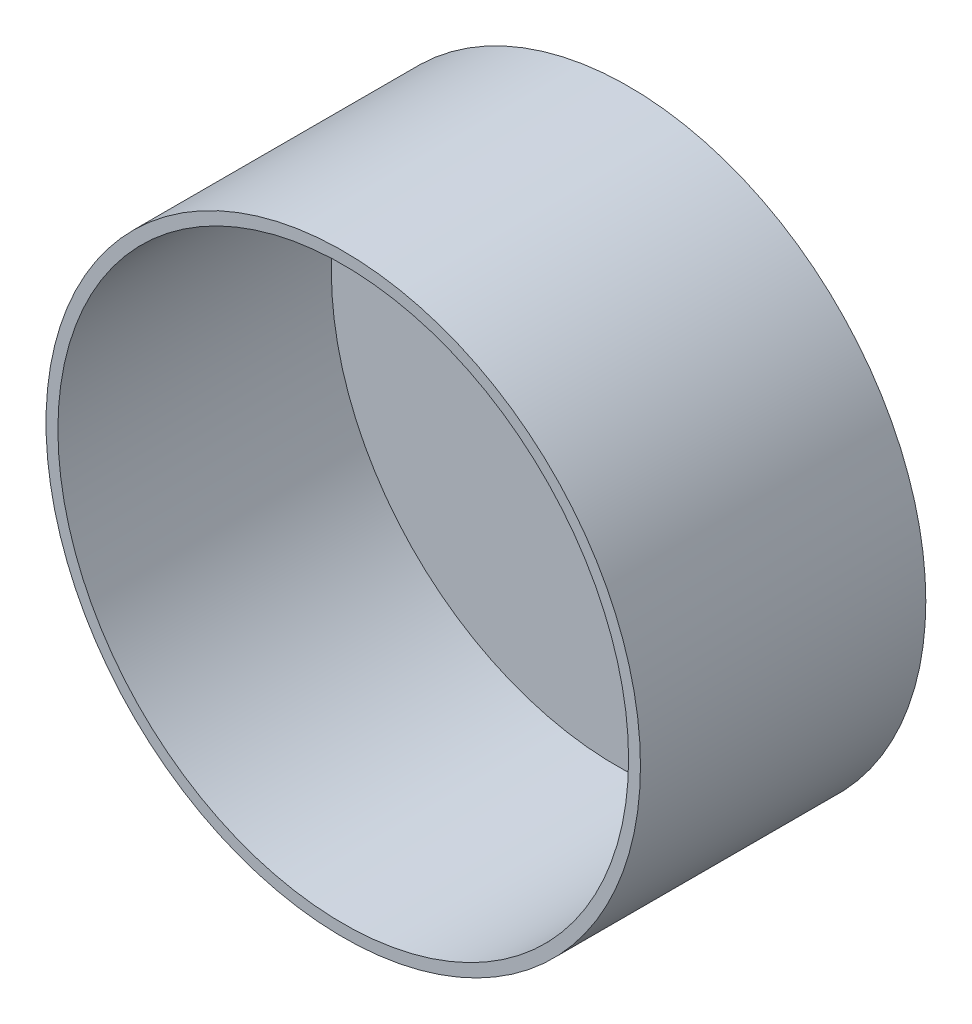
ISO-10303-21;
HEADER;
FILE_DESCRIPTION(('STEP AP214'),'2;1');
FILE_NAME('part.step','',(''),(''),'','','');
FILE_SCHEMA(('AUTOMOTIVE_DESIGN { 1 0 10303 214 1 1 1 1 }'));
ENDSEC;
DATA;
#1=APPLICATION_CONTEXT('core data for automotive mechanical design processes');
#2=APPLICATION_PROTOCOL_DEFINITION('international standard','automotive_design',2000,#1);
#3=PRODUCT_CONTEXT('',#1,'mechanical');
#4=PRODUCT('Part','Part','',(#3));
#5=PRODUCT_RELATED_PRODUCT_CATEGORY('part','',(#4));
#6=PRODUCT_DEFINITION_FORMATION('','',#4);
#7=PRODUCT_DEFINITION_CONTEXT('part definition',#1,'design');
#8=PRODUCT_DEFINITION('design','',#6,#7);
#9=PRODUCT_DEFINITION_SHAPE('','',#8);
#10=(LENGTH_UNIT() NAMED_UNIT(*) SI_UNIT(.MILLI.,.METRE.));
#11=(NAMED_UNIT(*) PLANE_ANGLE_UNIT() SI_UNIT($,.RADIAN.));
#12=(NAMED_UNIT(*) SI_UNIT($,.STERADIAN.) SOLID_ANGLE_UNIT());
#13=UNCERTAINTY_MEASURE_WITH_UNIT(LENGTH_MEASURE(1.E-05),#10,'distance_accuracy_value','');
#14=(GEOMETRIC_REPRESENTATION_CONTEXT(3) GLOBAL_UNCERTAINTY_ASSIGNED_CONTEXT((#13)) GLOBAL_UNIT_ASSIGNED_CONTEXT((#10,
#11,#12)) REPRESENTATION_CONTEXT('',''));
#15=CARTESIAN_POINT('',(0.,0.,0.));
#16=DIRECTION('',(0.,0.,1.));
#17=DIRECTION('',(1.,0.,0.));
#18=AXIS2_PLACEMENT_3D('',#15,#16,#17);
#19=CARTESIAN_POINT('',(0.,0.,120.));
#20=DIRECTION('',(0.,0.,-1.));
#21=DIRECTION('',(-1.,0.,0.));
#22=AXIS2_PLACEMENT_3D('',#19,#20,#21);
#23=CYLINDRICAL_SURFACE('',#22,125.);
#24=CARTESIAN_POINT('',(0.,0.,120.));
#25=DIRECTION('',(0.,0.,1.));
#26=DIRECTION('',(1.,0.,0.));
#27=AXIS2_PLACEMENT_3D('',#24,#25,#26);
#28=CIRCLE('',#27,125.);
#29=CARTESIAN_POINT('',(125.,0.,120.));
#30=VERTEX_POINT('',#29);
#31=EDGE_CURVE('E11',#30,#30,#28,.T.);
#32=ORIENTED_EDGE('',*,*,#31,.F.);
#33=EDGE_LOOP('',(#32));
#34=FACE_BOUND('',#33,.T.);
#35=CARTESIAN_POINT('',(0.,0.,0.));
#36=DIRECTION('',(0.,0.,1.));
#37=DIRECTION('',(1.,0.,0.));
#38=AXIS2_PLACEMENT_3D('',#35,#36,#37);
#39=CIRCLE('',#38,125.);
#40=CARTESIAN_POINT('',(125.,0.,0.));
#41=VERTEX_POINT('',#40);
#42=EDGE_CURVE('E39',#41,#41,#39,.T.);
#43=ORIENTED_EDGE('',*,*,#42,.T.);
#44=EDGE_LOOP('',(#43));
#45=FACE_BOUND('',#44,.T.);
#46=ADVANCED_FACE('F36',(#34,#45),#23,.T.);
#47=CARTESIAN_POINT('',(0.,0.,120.));
#48=DIRECTION('',(0.,0.,1.));
#49=DIRECTION('',(1.,0.,0.));
#50=AXIS2_PLACEMENT_3D('',#47,#48,#49);
#51=PLANE('',#50);
#52=CARTESIAN_POINT('',(0.,0.,120.));
#53=DIRECTION('',(0.,0.,1.));
#54=DIRECTION('',(1.,0.,0.));
#55=AXIS2_PLACEMENT_3D('',#52,#53,#54);
#56=CIRCLE('',#55,120.);
#57=CARTESIAN_POINT('',(120.,0.,120.));
#58=VERTEX_POINT('',#57);
#59=EDGE_CURVE('E50',#58,#58,#56,.T.);
#60=ORIENTED_EDGE('',*,*,#59,.F.);
#61=EDGE_LOOP('',(#60));
#62=FACE_BOUND('',#61,.T.);
#63=ORIENTED_EDGE('',*,*,#31,.T.);
#64=EDGE_LOOP('',(#63));
#65=FACE_BOUND('',#64,.T.);
#66=ADVANCED_FACE('F56',(#62,#65),#51,.T.);
#67=CARTESIAN_POINT('',(0.,0.,0.));
#68=DIRECTION('',(0.,0.,1.));
#69=DIRECTION('',(1.,0.,0.));
#70=AXIS2_PLACEMENT_3D('',#67,#68,#69);
#71=PLANE('',#70);
#72=ORIENTED_EDGE('',*,*,#42,.F.);
#73=EDGE_LOOP('',(#72));
#74=FACE_BOUND('',#73,.T.);
#75=ADVANCED_FACE('F58',(#74),#71,.F.);
#76=CARTESIAN_POINT('',(0.,0.,-339.411254969543));
#77=DIRECTION('',(0.,0.,1.));
#78=DIRECTION('',(1.,0.,0.));
#79=AXIS2_PLACEMENT_3D('',#76,#77,#78);
#80=CYLINDRICAL_SURFACE('',#79,120.);
#81=CARTESIAN_POINT('',(0.,0.,5.));
#82=DIRECTION('',(0.,0.,1.));
#83=DIRECTION('',(1.,0.,0.));
#84=AXIS2_PLACEMENT_3D('',#81,#82,#83);
#85=CIRCLE('',#84,120.);
#86=CARTESIAN_POINT('',(120.,0.,4.99999999999995));
#87=VERTEX_POINT('',#86);
#88=EDGE_CURVE('E46',#87,#87,#85,.F.);
#89=CARTESIAN_POINT('',(120.,0.,4.99999999999995));
#90=CARTESIAN_POINT('',(120.,0.,6.19791666666662));
#91=CARTESIAN_POINT('',(120.,0.,7.39583333333329));
#92=CARTESIAN_POINT('',(120.,0.,9.79166666666663));
#93=CARTESIAN_POINT('',(120.,0.,10.9895833333333));
#94=CARTESIAN_POINT('',(120.,0.,13.3854166666666));
#95=CARTESIAN_POINT('',(120.,0.,14.5833333333333));
#96=CARTESIAN_POINT('',(120.,0.,16.9791666666666));
#97=CARTESIAN_POINT('',(120.,0.,18.1770833333333));
#98=CARTESIAN_POINT('',(120.,0.,20.5729166666666));
#99=CARTESIAN_POINT('',(120.,0.,21.7708333333333));
#100=CARTESIAN_POINT('',(120.,0.,24.1666666666666));
#101=CARTESIAN_POINT('',(120.,0.,25.3645833333333));
#102=CARTESIAN_POINT('',(120.,0.,27.7604166666666));
#103=CARTESIAN_POINT('',(120.,0.,28.9583333333333));
#104=CARTESIAN_POINT('',(120.,0.,31.3541666666666));
#105=CARTESIAN_POINT('',(120.,0.,32.5520833333333));
#106=CARTESIAN_POINT('',(120.,0.,34.9479166666666));
#107=CARTESIAN_POINT('',(120.,0.,36.1458333333333));
#108=CARTESIAN_POINT('',(120.,0.,38.5416666666666));
#109=CARTESIAN_POINT('',(120.,0.,39.7395833333333));
#110=CARTESIAN_POINT('',(120.,0.,42.1354166666666));
#111=CARTESIAN_POINT('',(120.,0.,43.3333333333333));
#112=CARTESIAN_POINT('',(120.,0.,45.7291666666666));
#113=CARTESIAN_POINT('',(120.,0.,46.9270833333333));
#114=CARTESIAN_POINT('',(120.,0.,49.3229166666666));
#115=CARTESIAN_POINT('',(120.,0.,50.5208333333333));
#116=CARTESIAN_POINT('',(120.,0.,52.9166666666666));
#117=CARTESIAN_POINT('',(120.,0.,54.1145833333333));
#118=CARTESIAN_POINT('',(120.,0.,56.5104166666666));
#119=CARTESIAN_POINT('',(120.,0.,57.7083333333333));
#120=CARTESIAN_POINT('',(120.,0.,60.1041666666666));
#121=CARTESIAN_POINT('',(120.,0.,61.3020833333333));
#122=CARTESIAN_POINT('',(120.,0.,63.6979166666666));
#123=CARTESIAN_POINT('',(120.,0.,64.8958333333333));
#124=CARTESIAN_POINT('',(120.,0.,67.2916666666666));
#125=CARTESIAN_POINT('',(120.,0.,68.4895833333333));
#126=CARTESIAN_POINT('',(120.,0.,70.8854166666666));
#127=CARTESIAN_POINT('',(120.,0.,72.0833333333333));
#128=CARTESIAN_POINT('',(120.,0.,74.4791666666666));
#129=CARTESIAN_POINT('',(120.,0.,75.6770833333333));
#130=CARTESIAN_POINT('',(120.,0.,78.0729166666666));
#131=CARTESIAN_POINT('',(120.,0.,79.2708333333333));
#132=CARTESIAN_POINT('',(120.,0.,81.6666666666666));
#133=CARTESIAN_POINT('',(120.,0.,82.8645833333333));
#134=CARTESIAN_POINT('',(120.,0.,85.2604166666666));
#135=CARTESIAN_POINT('',(120.,0.,86.4583333333333));
#136=CARTESIAN_POINT('',(120.,0.,88.8541666666666));
#137=CARTESIAN_POINT('',(120.,0.,90.0520833333333));
#138=CARTESIAN_POINT('',(120.,0.,92.4479166666666));
#139=CARTESIAN_POINT('',(120.,0.,93.6458333333333));
#140=CARTESIAN_POINT('',(120.,0.,96.0416666666666));
#141=CARTESIAN_POINT('',(120.,0.,97.2395833333333));
#142=CARTESIAN_POINT('',(120.,0.,99.6354166666666));
#143=CARTESIAN_POINT('',(120.,0.,100.833333333333));
#144=CARTESIAN_POINT('',(120.,0.,103.229166666667));
#145=CARTESIAN_POINT('',(120.,0.,104.427083333333));
#146=CARTESIAN_POINT('',(120.,0.,106.822916666667));
#147=CARTESIAN_POINT('',(120.,0.,108.020833333333));
#148=CARTESIAN_POINT('',(120.,0.,110.416666666667));
#149=CARTESIAN_POINT('',(120.,0.,111.614583333333));
#150=CARTESIAN_POINT('',(120.,0.,114.010416666667));
#151=CARTESIAN_POINT('',(120.,0.,115.208333333333));
#152=CARTESIAN_POINT('',(120.,0.,117.604166666667));
#153=CARTESIAN_POINT('',(120.,0.,118.802083333333));
#154=CARTESIAN_POINT('',(120.,0.,120.));
#155=B_SPLINE_CURVE_WITH_KNOTS('',3,(#89,#90,#91,#92,#93,#94,#95,#96,#97,#98,#99,#100,#101,#102,
#103,#104,#105,#106,#107,#108,#109,#110,#111,#112,#113,#114,#115,#116,#117,#118,#119,#120,#121,
#122,#123,#124,#125,#126,#127,#128,#129,#130,#131,#132,#133,#134,#135,#136,#137,#138,#139,#140,
#141,#142,#143,#144,#145,#146,#147,#148,#149,#150,#151,#152,#153,#154),.UNSPECIFIED.,.F.,.F.,(4,
2,2,2,2,2,2,2,2,2,2,2,2,2,2,2,2,2,2,2,2,2,2,2,2,2,2,2,2,2,2,2,4),(0.,3.59375000000001,
7.18750000000001,10.78125,14.375,17.96875,21.5625,25.15625,28.75,32.34375,35.9375,39.53125,
43.125,46.71875,50.3125,53.90625,57.5,61.09375,64.6875,68.28125,71.875,75.46875,79.0625,
82.65625,86.25,89.84375,93.4375,97.03125,100.625,104.21875,107.8125,111.40625,115.),.UNSPECIFIED.);
#156=EDGE_CURVE('BSEAM54',#87,#58,#155,.T.);
#157=ORIENTED_EDGE('',*,*,#88,.T.);
#158=ORIENTED_EDGE('',*,*,#59,.T.);
#159=ORIENTED_EDGE('',*,*,#156,.T.);
#160=ORIENTED_EDGE('',*,*,#156,.F.);
#161=EDGE_LOOP('',(#157,#159,#158,#160));
#162=FACE_BOUND('',#161,.T.);
#163=ADVANCED_FACE('F54',(#162),#80,.F.);
#164=CARTESIAN_POINT('',(0.,0.,5.));
#165=DIRECTION('',(0.,0.,1.));
#166=DIRECTION('',(1.,0.,0.));
#167=AXIS2_PLACEMENT_3D('',#164,#165,#166);
#168=PLANE('',#167);
#169=ORIENTED_EDGE('',*,*,#88,.F.);
#170=EDGE_LOOP('',(#169));
#171=FACE_BOUND('',#170,.T.);
#172=ADVANCED_FACE('F69',(#171),#168,.T.);
#173=CLOSED_SHELL('',(#46,#66,#75,#163,#172));
#174=MANIFOLD_SOLID_BREP('B2',#173);
#175=ADVANCED_BREP_SHAPE_REPRESENTATION('',(#18,#174),#14);
#176=SHAPE_DEFINITION_REPRESENTATION(#9,#175);
ENDSEC;
END-ISO-10303-21;
